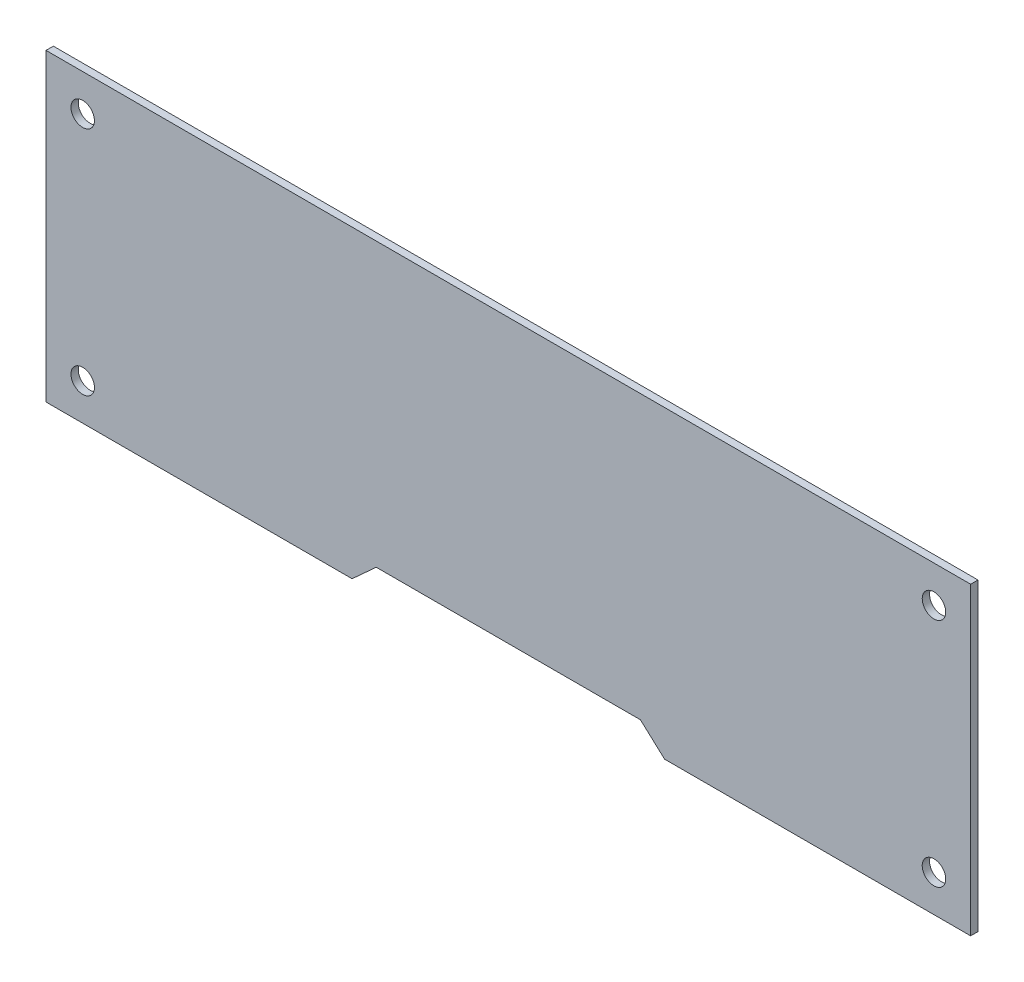
ISO-10303-21;
HEADER;
FILE_DESCRIPTION(('STEP AP214'),'2;1');
FILE_NAME('part.step','',(''),(''),'','','');
FILE_SCHEMA(('AUTOMOTIVE_DESIGN { 1 0 10303 214 1 1 1 1 }'));
ENDSEC;
DATA;
#1=APPLICATION_CONTEXT('core data for automotive mechanical design processes');
#2=APPLICATION_PROTOCOL_DEFINITION('international standard','automotive_design',2000,#1);
#3=PRODUCT_CONTEXT('',#1,'mechanical');
#4=PRODUCT('Part','Part','',(#3));
#5=PRODUCT_RELATED_PRODUCT_CATEGORY('part','',(#4));
#6=PRODUCT_DEFINITION_FORMATION('','',#4);
#7=PRODUCT_DEFINITION_CONTEXT('part definition',#1,'design');
#8=PRODUCT_DEFINITION('design','',#6,#7);
#9=PRODUCT_DEFINITION_SHAPE('','',#8);
#10=(LENGTH_UNIT() NAMED_UNIT(*) SI_UNIT(.MILLI.,.METRE.));
#11=(NAMED_UNIT(*) PLANE_ANGLE_UNIT() SI_UNIT($,.RADIAN.));
#12=(NAMED_UNIT(*) SI_UNIT($,.STERADIAN.) SOLID_ANGLE_UNIT());
#13=UNCERTAINTY_MEASURE_WITH_UNIT(LENGTH_MEASURE(1.E-05),#10,'distance_accuracy_value','');
#14=(GEOMETRIC_REPRESENTATION_CONTEXT(3) GLOBAL_UNCERTAINTY_ASSIGNED_CONTEXT((#13)) GLOBAL_UNIT_ASSIGNED_CONTEXT((#10,
#11,#12)) REPRESENTATION_CONTEXT('',''));
#15=CARTESIAN_POINT('',(0.,0.,0.));
#16=DIRECTION('',(0.,0.,1.));
#17=DIRECTION('',(1.,0.,0.));
#18=AXIS2_PLACEMENT_3D('',#15,#16,#17);
#19=CARTESIAN_POINT('',(63.,-20.75,1.));
#20=DIRECTION('',(0.,1.,0.));
#21=DIRECTION('',(-1.,0.,0.));
#22=AXIS2_PLACEMENT_3D('',#19,#20,#21);
#23=PLANE('',#22);
#24=DIRECTION('',(1.,0.,0.));
#25=VECTOR('',#24,1.);
#26=CARTESIAN_POINT('',(63.,-20.75,0.));
#27=LINE('',#26,#25);
#28=CARTESIAN_POINT('',(-63.,-20.75,0.));
#29=VERTEX_POINT('',#28);
#30=CARTESIAN_POINT('',(-21.2922191626319,-20.75,0.));
#31=VERTEX_POINT('',#30);
#32=EDGE_CURVE('E131',#29,#31,#27,.T.);
#33=ORIENTED_EDGE('',*,*,#32,.T.);
#34=DIRECTION('',(0.,0.,1.));
#35=VECTOR('',#34,1.);
#36=CARTESIAN_POINT('',(-21.2922191626319,-20.75,0.));
#37=LINE('',#36,#35);
#38=CARTESIAN_POINT('',(-21.2922191626319,-20.75,1.));
#39=VERTEX_POINT('',#38);
#40=EDGE_CURVE('E165',#31,#39,#37,.T.);
#41=ORIENTED_EDGE('',*,*,#40,.T.);
#42=DIRECTION('',(1.,0.,0.));
#43=VECTOR('',#42,1.);
#44=CARTESIAN_POINT('',(63.,-20.75,1.));
#45=LINE('',#44,#43);
#46=CARTESIAN_POINT('',(-63.,-20.75,1.));
#47=VERTEX_POINT('',#46);
#48=EDGE_CURVE('E86',#47,#39,#45,.T.);
#49=ORIENTED_EDGE('',*,*,#48,.F.);
#50=DIRECTION('',(0.,0.,-1.));
#51=VECTOR('',#50,1.);
#52=CARTESIAN_POINT('',(-63.,-20.75,1.));
#53=LINE('',#52,#51);
#54=EDGE_CURVE('E11',#47,#29,#53,.T.);
#55=ORIENTED_EDGE('',*,*,#54,.T.);
#56=EDGE_LOOP('',(#33,#41,#49,#55));
#57=FACE_BOUND('',#56,.T.);
#58=ADVANCED_FACE('F34',(#57),#23,.F.);
#59=CARTESIAN_POINT('',(-63.,-20.75,1.));
#60=DIRECTION('',(1.,0.,0.));
#61=DIRECTION('',(0.,0.,-1.));
#62=AXIS2_PLACEMENT_3D('',#59,#60,#61);
#63=PLANE('',#62);
#64=DIRECTION('',(0.,-1.,0.));
#65=VECTOR('',#64,1.);
#66=CARTESIAN_POINT('',(-63.,-20.75,0.));
#67=LINE('',#66,#65);
#68=CARTESIAN_POINT('',(-63.,20.75,0.));
#69=VERTEX_POINT('',#68);
#70=EDGE_CURVE('E132',#69,#29,#67,.T.);
#71=ORIENTED_EDGE('',*,*,#70,.T.);
#72=ORIENTED_EDGE('',*,*,#54,.F.);
#73=DIRECTION('',(0.,-1.,0.));
#74=VECTOR('',#73,1.);
#75=CARTESIAN_POINT('',(-63.,-20.75,1.));
#76=LINE('',#75,#74);
#77=CARTESIAN_POINT('',(-63.,20.75,1.));
#78=VERTEX_POINT('',#77);
#79=EDGE_CURVE('E142',#78,#47,#76,.T.);
#80=ORIENTED_EDGE('',*,*,#79,.F.);
#81=DIRECTION('',(0.,0.,-1.));
#82=VECTOR('',#81,1.);
#83=CARTESIAN_POINT('',(-63.,20.75,1.));
#84=LINE('',#83,#82);
#85=EDGE_CURVE('E143',#78,#69,#84,.T.);
#86=ORIENTED_EDGE('',*,*,#85,.T.);
#87=EDGE_LOOP('',(#71,#72,#80,#86));
#88=FACE_BOUND('',#87,.T.);
#89=ADVANCED_FACE('F36',(#88),#63,.F.);
#90=CARTESIAN_POINT('',(21.2922191626319,-20.75,1.));
#91=VERTEX_POINT('',#90);
#92=CARTESIAN_POINT('',(63.,-20.75,1.));
#93=VERTEX_POINT('',#92);
#94=EDGE_CURVE('E125',#91,#93,#45,.T.);
#95=ORIENTED_EDGE('',*,*,#94,.F.);
#96=DIRECTION('',(0.,0.,1.));
#97=VECTOR('',#96,1.);
#98=CARTESIAN_POINT('',(21.2922191626319,-20.75,0.));
#99=LINE('',#98,#97);
#100=CARTESIAN_POINT('',(21.2922191626319,-20.75,0.));
#101=VERTEX_POINT('',#100);
#102=EDGE_CURVE('E112',#101,#91,#99,.T.);
#103=ORIENTED_EDGE('',*,*,#102,.F.);
#104=CARTESIAN_POINT('',(63.,-20.75,0.));
#105=VERTEX_POINT('',#104);
#106=EDGE_CURVE('E123',#101,#105,#27,.T.);
#107=ORIENTED_EDGE('',*,*,#106,.T.);
#108=DIRECTION('',(0.,0.,-1.));
#109=VECTOR('',#108,1.);
#110=CARTESIAN_POINT('',(63.,-20.75,1.));
#111=LINE('',#110,#109);
#112=EDGE_CURVE('E42',#93,#105,#111,.T.);
#113=ORIENTED_EDGE('',*,*,#112,.F.);
#114=EDGE_LOOP('',(#95,#103,#107,#113));
#115=FACE_BOUND('',#114,.T.);
#116=ADVANCED_FACE('F121',(#115),#23,.F.);
#117=CARTESIAN_POINT('',(63.,-20.75,1.));
#118=DIRECTION('',(-1.,0.,0.));
#119=DIRECTION('',(0.,0.,1.));
#120=AXIS2_PLACEMENT_3D('',#117,#118,#119);
#121=PLANE('',#120);
#122=DIRECTION('',(0.,1.,0.));
#123=VECTOR('',#122,1.);
#124=CARTESIAN_POINT('',(63.,-20.75,0.));
#125=LINE('',#124,#123);
#126=CARTESIAN_POINT('',(63.,20.75,0.));
#127=VERTEX_POINT('',#126);
#128=EDGE_CURVE('E130',#105,#127,#125,.T.);
#129=ORIENTED_EDGE('',*,*,#128,.T.);
#130=DIRECTION('',(0.,0.,-1.));
#131=VECTOR('',#130,1.);
#132=CARTESIAN_POINT('',(63.,20.75,1.));
#133=LINE('',#132,#131);
#134=CARTESIAN_POINT('',(63.,20.75,1.));
#135=VERTEX_POINT('',#134);
#136=EDGE_CURVE('E145',#135,#127,#133,.T.);
#137=ORIENTED_EDGE('',*,*,#136,.F.);
#138=DIRECTION('',(0.,1.,0.));
#139=VECTOR('',#138,1.);
#140=CARTESIAN_POINT('',(63.,-20.75,1.));
#141=LINE('',#140,#139);
#142=EDGE_CURVE('E150',#93,#135,#141,.T.);
#143=ORIENTED_EDGE('',*,*,#142,.F.);
#144=ORIENTED_EDGE('',*,*,#112,.T.);
#145=EDGE_LOOP('',(#129,#137,#143,#144));
#146=FACE_BOUND('',#145,.T.);
#147=ADVANCED_FACE('F148',(#146),#121,.F.);
#148=CARTESIAN_POINT('',(63.,20.75,1.));
#149=DIRECTION('',(0.,-1.,0.));
#150=DIRECTION('',(1.,0.,0.));
#151=AXIS2_PLACEMENT_3D('',#148,#149,#150);
#152=PLANE('',#151);
#153=DIRECTION('',(-1.,0.,0.));
#154=VECTOR('',#153,1.);
#155=CARTESIAN_POINT('',(63.,20.75,0.));
#156=LINE('',#155,#154);
#157=EDGE_CURVE('E79',#127,#69,#156,.T.);
#158=ORIENTED_EDGE('',*,*,#157,.T.);
#159=ORIENTED_EDGE('',*,*,#85,.F.);
#160=DIRECTION('',(-1.,0.,0.));
#161=VECTOR('',#160,1.);
#162=CARTESIAN_POINT('',(63.,20.75,1.));
#163=LINE('',#162,#161);
#164=EDGE_CURVE('E58',#135,#78,#163,.T.);
#165=ORIENTED_EDGE('',*,*,#164,.F.);
#166=ORIENTED_EDGE('',*,*,#136,.T.);
#167=EDGE_LOOP('',(#158,#159,#165,#166));
#168=FACE_BOUND('',#167,.T.);
#169=ADVANCED_FACE('F197',(#168),#152,.F.);
#170=CARTESIAN_POINT('',(0.,0.,1.));
#171=DIRECTION('',(0.,0.,1.));
#172=DIRECTION('',(1.,0.,0.));
#173=AXIS2_PLACEMENT_3D('',#170,#171,#172);
#174=PLANE('',#173);
#175=DIRECTION('',(-0.739149107100604,-0.673541830529018,0.));
#176=VECTOR('',#175,1.);
#177=CARTESIAN_POINT('',(-21.2922191626319,-20.75,1.));
#178=LINE('',#177,#176);
#179=CARTESIAN_POINT('',(-18.,-17.75,1.));
#180=VERTEX_POINT('',#179);
#181=EDGE_CURVE('E117',#180,#39,#178,.T.);
#182=ORIENTED_EDGE('',*,*,#181,.F.);
#183=DIRECTION('',(-1.,0.,0.));
#184=VECTOR('',#183,1.);
#185=CARTESIAN_POINT('',(-18.,-17.75,1.));
#186=LINE('',#185,#184);
#187=CARTESIAN_POINT('',(18.,-17.75,1.));
#188=VERTEX_POINT('',#187);
#189=EDGE_CURVE('E184',#188,#180,#186,.T.);
#190=ORIENTED_EDGE('',*,*,#189,.F.);
#191=DIRECTION('',(-0.739149107100605,0.673541830529016,0.));
#192=VECTOR('',#191,1.);
#193=CARTESIAN_POINT('',(21.2922191626319,-20.75,1.));
#194=LINE('',#193,#192);
#195=EDGE_CURVE('E187',#91,#188,#194,.T.);
#196=ORIENTED_EDGE('',*,*,#195,.F.);
#197=ORIENTED_EDGE('',*,*,#94,.T.);
#198=ORIENTED_EDGE('',*,*,#142,.T.);
#199=ORIENTED_EDGE('',*,*,#164,.T.);
#200=ORIENTED_EDGE('',*,*,#79,.T.);
#201=ORIENTED_EDGE('',*,*,#48,.T.);
#202=EDGE_LOOP('',(#182,#190,#196,#197,#198,#199,#200,#201));
#203=FACE_BOUND('',#202,.T.);
#204=CARTESIAN_POINT('',(58.,15.75,1.));
#205=DIRECTION('',(0.,0.,1.));
#206=DIRECTION('',(-1.,0.,0.));
#207=AXIS2_PLACEMENT_3D('',#204,#205,#206);
#208=CIRCLE('',#207,1.6);
#209=CARTESIAN_POINT('',(56.4,15.75,1.));
#210=VERTEX_POINT('',#209);
#211=EDGE_CURVE('E161',#210,#210,#208,.T.);
#212=ORIENTED_EDGE('',*,*,#211,.F.);
#213=EDGE_LOOP('',(#212));
#214=FACE_BOUND('',#213,.T.);
#215=CARTESIAN_POINT('',(58.,-15.75,1.));
#216=DIRECTION('',(0.,0.,1.));
#217=DIRECTION('',(1.,0.,0.));
#218=AXIS2_PLACEMENT_3D('',#215,#216,#217);
#219=CIRCLE('',#218,1.6);
#220=CARTESIAN_POINT('',(59.6,-15.75,1.));
#221=VERTEX_POINT('',#220);
#222=EDGE_CURVE('E168',#221,#221,#219,.T.);
#223=ORIENTED_EDGE('',*,*,#222,.F.);
#224=EDGE_LOOP('',(#223));
#225=FACE_BOUND('',#224,.T.);
#226=CARTESIAN_POINT('',(-58.,-15.75,1.));
#227=DIRECTION('',(0.,0.,1.));
#228=DIRECTION('',(-1.,0.,0.));
#229=AXIS2_PLACEMENT_3D('',#226,#227,#228);
#230=CIRCLE('',#229,1.6);
#231=CARTESIAN_POINT('',(-59.6,-15.75,1.));
#232=VERTEX_POINT('',#231);
#233=EDGE_CURVE('E174',#232,#232,#230,.T.);
#234=ORIENTED_EDGE('',*,*,#233,.F.);
#235=EDGE_LOOP('',(#234));
#236=FACE_BOUND('',#235,.T.);
#237=CARTESIAN_POINT('',(-58.,15.75,1.));
#238=DIRECTION('',(0.,0.,1.));
#239=DIRECTION('',(1.,0.,0.));
#240=AXIS2_PLACEMENT_3D('',#237,#238,#239);
#241=CIRCLE('',#240,1.6);
#242=CARTESIAN_POINT('',(-56.4,15.75,1.));
#243=VERTEX_POINT('',#242);
#244=EDGE_CURVE('E155',#243,#243,#241,.T.);
#245=ORIENTED_EDGE('',*,*,#244,.F.);
#246=EDGE_LOOP('',(#245));
#247=FACE_BOUND('',#246,.T.);
#248=ADVANCED_FACE('F199',(#203,#214,#225,#236,#247),#174,.T.);
#249=CARTESIAN_POINT('',(0.,0.,0.));
#250=DIRECTION('',(0.,0.,1.));
#251=DIRECTION('',(1.,0.,0.));
#252=AXIS2_PLACEMENT_3D('',#249,#250,#251);
#253=PLANE('',#252);
#254=CARTESIAN_POINT('',(58.,15.75,0.));
#255=DIRECTION('',(0.,0.,1.));
#256=DIRECTION('',(-1.,0.,0.));
#257=AXIS2_PLACEMENT_3D('',#254,#255,#256);
#258=CIRCLE('',#257,1.6);
#259=CARTESIAN_POINT('',(56.4,15.75,0.));
#260=VERTEX_POINT('',#259);
#261=EDGE_CURVE('E164',#260,#260,#258,.T.);
#262=ORIENTED_EDGE('',*,*,#261,.T.);
#263=EDGE_LOOP('',(#262));
#264=FACE_BOUND('',#263,.T.);
#265=CARTESIAN_POINT('',(58.,-15.75,0.));
#266=DIRECTION('',(0.,0.,1.));
#267=DIRECTION('',(1.,0.,0.));
#268=AXIS2_PLACEMENT_3D('',#265,#266,#267);
#269=CIRCLE('',#268,1.6);
#270=CARTESIAN_POINT('',(59.6,-15.75,0.));
#271=VERTEX_POINT('',#270);
#272=EDGE_CURVE('E171',#271,#271,#269,.T.);
#273=ORIENTED_EDGE('',*,*,#272,.T.);
#274=EDGE_LOOP('',(#273));
#275=FACE_BOUND('',#274,.T.);
#276=CARTESIAN_POINT('',(-58.,-15.75,0.));
#277=DIRECTION('',(0.,0.,1.));
#278=DIRECTION('',(-1.,0.,0.));
#279=AXIS2_PLACEMENT_3D('',#276,#277,#278);
#280=CIRCLE('',#279,1.6);
#281=CARTESIAN_POINT('',(-59.6,-15.75,0.));
#282=VERTEX_POINT('',#281);
#283=EDGE_CURVE('E158',#282,#282,#280,.T.);
#284=ORIENTED_EDGE('',*,*,#283,.T.);
#285=EDGE_LOOP('',(#284));
#286=FACE_BOUND('',#285,.T.);
#287=CARTESIAN_POINT('',(-58.,15.75,0.));
#288=DIRECTION('',(0.,0.,1.));
#289=DIRECTION('',(1.,0.,0.));
#290=AXIS2_PLACEMENT_3D('',#287,#288,#289);
#291=CIRCLE('',#290,1.6);
#292=CARTESIAN_POINT('',(-56.4,15.75,0.));
#293=VERTEX_POINT('',#292);
#294=EDGE_CURVE('E136',#293,#293,#291,.T.);
#295=ORIENTED_EDGE('',*,*,#294,.T.);
#296=EDGE_LOOP('',(#295));
#297=FACE_BOUND('',#296,.T.);
#298=DIRECTION('',(-1.,0.,0.));
#299=VECTOR('',#298,1.);
#300=CARTESIAN_POINT('',(-18.,-17.75,0.));
#301=LINE('',#300,#299);
#302=CARTESIAN_POINT('',(18.,-17.75,0.));
#303=VERTEX_POINT('',#302);
#304=CARTESIAN_POINT('',(-18.,-17.75,0.));
#305=VERTEX_POINT('',#304);
#306=EDGE_CURVE('E49',#303,#305,#301,.T.);
#307=ORIENTED_EDGE('',*,*,#306,.T.);
#308=DIRECTION('',(-0.739149107100604,-0.673541830529018,0.));
#309=VECTOR('',#308,1.);
#310=CARTESIAN_POINT('',(-21.2922191626319,-20.75,0.));
#311=LINE('',#310,#309);
#312=EDGE_CURVE('E126',#305,#31,#311,.T.);
#313=ORIENTED_EDGE('',*,*,#312,.T.);
#314=ORIENTED_EDGE('',*,*,#32,.F.);
#315=ORIENTED_EDGE('',*,*,#70,.F.);
#316=ORIENTED_EDGE('',*,*,#157,.F.);
#317=ORIENTED_EDGE('',*,*,#128,.F.);
#318=ORIENTED_EDGE('',*,*,#106,.F.);
#319=DIRECTION('',(-0.739149107100605,0.673541830529016,0.));
#320=VECTOR('',#319,1.);
#321=CARTESIAN_POINT('',(21.2922191626319,-20.75,0.));
#322=LINE('',#321,#320);
#323=EDGE_CURVE('E108',#101,#303,#322,.T.);
#324=ORIENTED_EDGE('',*,*,#323,.T.);
#325=EDGE_LOOP('',(#307,#313,#314,#315,#316,#317,#318,#324));
#326=FACE_BOUND('',#325,.T.);
#327=ADVANCED_FACE('F129',(#264,#275,#286,#297,#326),#253,.F.);
#328=CARTESIAN_POINT('',(-58.,15.75,0.));
#329=DIRECTION('',(0.,0.,1.));
#330=DIRECTION('',(1.,0.,0.));
#331=AXIS2_PLACEMENT_3D('',#328,#329,#330);
#332=CYLINDRICAL_SURFACE('',#331,1.6);
#333=ORIENTED_EDGE('',*,*,#294,.F.);
#334=EDGE_LOOP('',(#333));
#335=FACE_BOUND('',#334,.T.);
#336=ORIENTED_EDGE('',*,*,#244,.T.);
#337=EDGE_LOOP('',(#336));
#338=FACE_BOUND('',#337,.T.);
#339=ADVANCED_FACE('F234',(#335,#338),#332,.F.);
#340=CARTESIAN_POINT('',(-58.,-15.75,0.));
#341=DIRECTION('',(0.,0.,1.));
#342=DIRECTION('',(1.,0.,0.));
#343=AXIS2_PLACEMENT_3D('',#340,#341,#342);
#344=CYLINDRICAL_SURFACE('',#343,1.6);
#345=ORIENTED_EDGE('',*,*,#283,.F.);
#346=EDGE_LOOP('',(#345));
#347=FACE_BOUND('',#346,.T.);
#348=ORIENTED_EDGE('',*,*,#233,.T.);
#349=EDGE_LOOP('',(#348));
#350=FACE_BOUND('',#349,.T.);
#351=ADVANCED_FACE('F239',(#347,#350),#344,.F.);
#352=CARTESIAN_POINT('',(58.,-15.75,0.));
#353=DIRECTION('',(0.,0.,1.));
#354=DIRECTION('',(1.,0.,0.));
#355=AXIS2_PLACEMENT_3D('',#352,#353,#354);
#356=CYLINDRICAL_SURFACE('',#355,1.6);
#357=ORIENTED_EDGE('',*,*,#272,.F.);
#358=EDGE_LOOP('',(#357));
#359=FACE_BOUND('',#358,.T.);
#360=ORIENTED_EDGE('',*,*,#222,.T.);
#361=EDGE_LOOP('',(#360));
#362=FACE_BOUND('',#361,.T.);
#363=ADVANCED_FACE('F251',(#359,#362),#356,.F.);
#364=CARTESIAN_POINT('',(58.,15.75,0.));
#365=DIRECTION('',(0.,0.,1.));
#366=DIRECTION('',(1.,0.,0.));
#367=AXIS2_PLACEMENT_3D('',#364,#365,#366);
#368=CYLINDRICAL_SURFACE('',#367,1.6);
#369=ORIENTED_EDGE('',*,*,#261,.F.);
#370=EDGE_LOOP('',(#369));
#371=FACE_BOUND('',#370,.T.);
#372=ORIENTED_EDGE('',*,*,#211,.T.);
#373=EDGE_LOOP('',(#372));
#374=FACE_BOUND('',#373,.T.);
#375=ADVANCED_FACE('F261',(#371,#374),#368,.F.);
#376=CARTESIAN_POINT('',(-21.2922191626319,-20.75,0.));
#377=DIRECTION('',(-0.673541830529018,0.739149107100604,0.));
#378=DIRECTION('',(-0.739149107100604,-0.673541830529018,0.));
#379=AXIS2_PLACEMENT_3D('',#376,#377,#378);
#380=PLANE('',#379);
#381=ORIENTED_EDGE('',*,*,#181,.T.);
#382=ORIENTED_EDGE('',*,*,#40,.F.);
#383=ORIENTED_EDGE('',*,*,#312,.F.);
#384=DIRECTION('',(0.,0.,1.));
#385=VECTOR('',#384,1.);
#386=CARTESIAN_POINT('',(-18.,-17.75,0.));
#387=LINE('',#386,#385);
#388=EDGE_CURVE('E180',#305,#180,#387,.T.);
#389=ORIENTED_EDGE('',*,*,#388,.T.);
#390=EDGE_LOOP('',(#381,#382,#383,#389));
#391=FACE_BOUND('',#390,.T.);
#392=ADVANCED_FACE('F270',(#391),#380,.F.);
#393=CARTESIAN_POINT('',(-18.,-17.75,0.));
#394=DIRECTION('',(0.,1.,0.));
#395=DIRECTION('',(-1.,0.,0.));
#396=AXIS2_PLACEMENT_3D('',#393,#394,#395);
#397=PLANE('',#396);
#398=ORIENTED_EDGE('',*,*,#189,.T.);
#399=ORIENTED_EDGE('',*,*,#388,.F.);
#400=ORIENTED_EDGE('',*,*,#306,.F.);
#401=DIRECTION('',(0.,0.,1.));
#402=VECTOR('',#401,1.);
#403=CARTESIAN_POINT('',(18.,-17.75,0.));
#404=LINE('',#403,#402);
#405=EDGE_CURVE('E114',#303,#188,#404,.T.);
#406=ORIENTED_EDGE('',*,*,#405,.T.);
#407=EDGE_LOOP('',(#398,#399,#400,#406));
#408=FACE_BOUND('',#407,.T.);
#409=ADVANCED_FACE('F286',(#408),#397,.F.);
#410=CARTESIAN_POINT('',(21.2922191626319,-20.75,0.));
#411=DIRECTION('',(0.673541830529016,0.739149107100605,0.));
#412=DIRECTION('',(-0.739149107100605,0.673541830529016,0.));
#413=AXIS2_PLACEMENT_3D('',#410,#411,#412);
#414=PLANE('',#413);
#415=ORIENTED_EDGE('',*,*,#195,.T.);
#416=ORIENTED_EDGE('',*,*,#405,.F.);
#417=ORIENTED_EDGE('',*,*,#323,.F.);
#418=ORIENTED_EDGE('',*,*,#102,.T.);
#419=EDGE_LOOP('',(#415,#416,#417,#418));
#420=FACE_BOUND('',#419,.T.);
#421=ADVANCED_FACE('F111',(#420),#414,.F.);
#422=CLOSED_SHELL('',(#58,#89,#116,#147,#169,#248,#327,#339,#351,#363,#375,#392,#409,#421));
#423=MANIFOLD_SOLID_BREP('B2',#422);
#424=ADVANCED_BREP_SHAPE_REPRESENTATION('',(#18,#423),#14);
#425=SHAPE_DEFINITION_REPRESENTATION(#9,#424);
ENDSEC;
END-ISO-10303-21;
